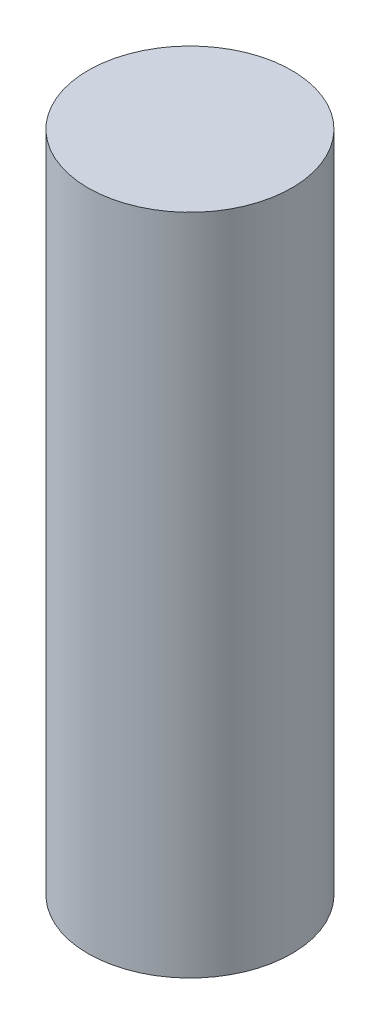
ISO-10303-21;
HEADER;
FILE_DESCRIPTION(('STEP AP214'),'2;1');
FILE_NAME('part.step','',(''),(''),'','','');
FILE_SCHEMA(('AUTOMOTIVE_DESIGN { 1 0 10303 214 1 1 1 1 }'));
ENDSEC;
DATA;
#1=APPLICATION_CONTEXT('core data for automotive mechanical design processes');
#2=APPLICATION_PROTOCOL_DEFINITION('international standard','automotive_design',2000,#1);
#3=PRODUCT_CONTEXT('',#1,'mechanical');
#4=PRODUCT('Part','Part','',(#3));
#5=PRODUCT_RELATED_PRODUCT_CATEGORY('part','',(#4));
#6=PRODUCT_DEFINITION_FORMATION('','',#4);
#7=PRODUCT_DEFINITION_CONTEXT('part definition',#1,'design');
#8=PRODUCT_DEFINITION('design','',#6,#7);
#9=PRODUCT_DEFINITION_SHAPE('','',#8);
#10=(LENGTH_UNIT() NAMED_UNIT(*) SI_UNIT(.MILLI.,.METRE.));
#11=(NAMED_UNIT(*) PLANE_ANGLE_UNIT() SI_UNIT($,.RADIAN.));
#12=(NAMED_UNIT(*) SI_UNIT($,.STERADIAN.) SOLID_ANGLE_UNIT());
#13=UNCERTAINTY_MEASURE_WITH_UNIT(LENGTH_MEASURE(1.E-05),#10,'distance_accuracy_value','');
#14=(GEOMETRIC_REPRESENTATION_CONTEXT(3) GLOBAL_UNCERTAINTY_ASSIGNED_CONTEXT((#13)) GLOBAL_UNIT_ASSIGNED_CONTEXT((#10,
#11,#12)) REPRESENTATION_CONTEXT('',''));
#15=CARTESIAN_POINT('',(0.,0.,0.));
#16=DIRECTION('',(0.,0.,1.));
#17=DIRECTION('',(1.,0.,0.));
#18=AXIS2_PLACEMENT_3D('',#15,#16,#17);
#19=CARTESIAN_POINT('',(0.,70.15,0.));
#20=DIRECTION('',(0.,-1.,0.));
#21=DIRECTION('',(0.,0.,-1.));
#22=AXIS2_PLACEMENT_3D('',#19,#20,#21);
#23=CYLINDRICAL_SURFACE('',#22,10.775);
#24=CARTESIAN_POINT('',(0.,70.15,0.));
#25=DIRECTION('',(0.,1.,0.));
#26=DIRECTION('',(0.,0.,1.));
#27=AXIS2_PLACEMENT_3D('',#24,#25,#26);
#28=CIRCLE('',#27,10.775);
#29=CARTESIAN_POINT('',(0.,70.15,10.775));
#30=VERTEX_POINT('',#29);
#31=EDGE_CURVE('E10',#30,#30,#28,.T.);
#32=ORIENTED_EDGE('',*,*,#31,.F.);
#33=EDGE_LOOP('',(#32));
#34=FACE_BOUND('',#33,.T.);
#35=CARTESIAN_POINT('',(0.,0.,0.));
#36=DIRECTION('',(0.,1.,0.));
#37=DIRECTION('',(0.,0.,1.));
#38=AXIS2_PLACEMENT_3D('',#35,#36,#37);
#39=CIRCLE('',#38,10.775);
#40=CARTESIAN_POINT('',(0.,0.,10.775));
#41=VERTEX_POINT('',#40);
#42=EDGE_CURVE('E38',#41,#41,#39,.T.);
#43=ORIENTED_EDGE('',*,*,#42,.T.);
#44=EDGE_LOOP('',(#43));
#45=FACE_BOUND('',#44,.T.);
#46=ADVANCED_FACE('F35',(#34,#45),#23,.T.);
#47=CARTESIAN_POINT('',(0.,70.15,0.));
#48=DIRECTION('',(0.,1.,0.));
#49=DIRECTION('',(0.,0.,1.));
#50=AXIS2_PLACEMENT_3D('',#47,#48,#49);
#51=PLANE('',#50);
#52=ORIENTED_EDGE('',*,*,#31,.T.);
#53=EDGE_LOOP('',(#52));
#54=FACE_BOUND('',#53,.T.);
#55=ADVANCED_FACE('F50',(#54),#51,.T.);
#56=CARTESIAN_POINT('',(0.,0.,0.));
#57=DIRECTION('',(0.,1.,0.));
#58=DIRECTION('',(0.,0.,1.));
#59=AXIS2_PLACEMENT_3D('',#56,#57,#58);
#60=PLANE('',#59);
#61=ORIENTED_EDGE('',*,*,#42,.F.);
#62=EDGE_LOOP('',(#61));
#63=FACE_BOUND('',#62,.T.);
#64=ADVANCED_FACE('F48',(#63),#60,.F.);
#65=CLOSED_SHELL('',(#46,#55,#64));
#66=MANIFOLD_SOLID_BREP('B2',#65);
#67=ADVANCED_BREP_SHAPE_REPRESENTATION('',(#18,#66),#14);
#68=SHAPE_DEFINITION_REPRESENTATION(#9,#67);
ENDSEC;
END-ISO-10303-21;
